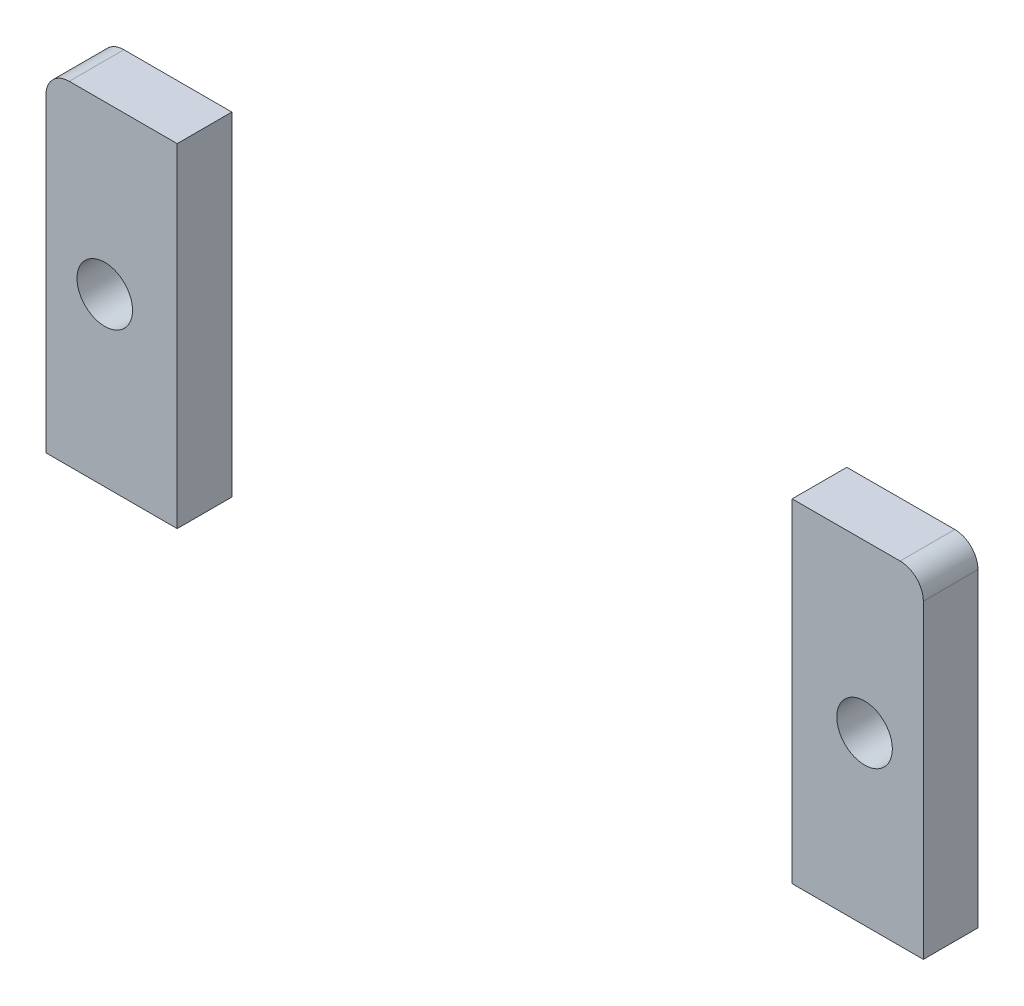
ISO-10303-21;
HEADER;
FILE_DESCRIPTION(('STEP AP214'),'2;1');
FILE_NAME('part.step','',(''),(''),'','','');
FILE_SCHEMA(('AUTOMOTIVE_DESIGN { 1 0 10303 214 1 1 1 1 }'));
ENDSEC;
DATA;
#1=APPLICATION_CONTEXT('core data for automotive mechanical design processes');
#2=APPLICATION_PROTOCOL_DEFINITION('international standard','automotive_design',2000,#1);
#3=PRODUCT_CONTEXT('',#1,'mechanical');
#4=PRODUCT('Part','Part','',(#3));
#5=PRODUCT_RELATED_PRODUCT_CATEGORY('part','',(#4));
#6=PRODUCT_DEFINITION_FORMATION('','',#4);
#7=PRODUCT_DEFINITION_CONTEXT('part definition',#1,'design');
#8=PRODUCT_DEFINITION('design','',#6,#7);
#9=PRODUCT_DEFINITION_SHAPE('','',#8);
#10=(LENGTH_UNIT() NAMED_UNIT(*) SI_UNIT(.MILLI.,.METRE.));
#11=(NAMED_UNIT(*) PLANE_ANGLE_UNIT() SI_UNIT($,.RADIAN.));
#12=(NAMED_UNIT(*) SI_UNIT($,.STERADIAN.) SOLID_ANGLE_UNIT());
#13=UNCERTAINTY_MEASURE_WITH_UNIT(LENGTH_MEASURE(1.E-05),#10,'distance_accuracy_value','');
#14=(GEOMETRIC_REPRESENTATION_CONTEXT(3) GLOBAL_UNCERTAINTY_ASSIGNED_CONTEXT((#13)) GLOBAL_UNIT_ASSIGNED_CONTEXT((#10,
#11,#12)) REPRESENTATION_CONTEXT('',''));
#15=CARTESIAN_POINT('',(0.,0.,0.));
#16=DIRECTION('',(0.,0.,1.));
#17=DIRECTION('',(1.,0.,0.));
#18=AXIS2_PLACEMENT_3D('',#15,#16,#17);
#19=CARTESIAN_POINT('',(-16.05,0.,2.));
#20=DIRECTION('',(1.,0.,0.));
#21=DIRECTION('',(0.,1.,0.));
#22=AXIS2_PLACEMENT_3D('',#19,#20,#21);
#23=PLANE('',#22);
#24=DIRECTION('',(0.,-1.,0.));
#25=VECTOR('',#24,1.);
#26=CARTESIAN_POINT('',(-16.05,0.,0.));
#27=LINE('',#26,#25);
#28=CARTESIAN_POINT('',(-16.05,5.25,0.));
#29=VERTEX_POINT('',#28);
#30=CARTESIAN_POINT('',(-16.05,-6.09999999999999,0.));
#31=VERTEX_POINT('',#30);
#32=EDGE_CURVE('E124',#29,#31,#27,.T.);
#33=ORIENTED_EDGE('',*,*,#32,.T.);
#34=DIRECTION('',(0.,0.,-1.));
#35=VECTOR('',#34,1.);
#36=CARTESIAN_POINT('',(-16.05,-6.09999999999999,2.));
#37=LINE('',#36,#35);
#38=CARTESIAN_POINT('',(-16.05,-6.09999999999999,2.));
#39=VERTEX_POINT('',#38);
#40=EDGE_CURVE('E12',#39,#31,#37,.T.);
#41=ORIENTED_EDGE('',*,*,#40,.F.);
#42=DIRECTION('',(0.,-1.,0.));
#43=VECTOR('',#42,1.);
#44=CARTESIAN_POINT('',(-16.05,0.,2.));
#45=LINE('',#44,#43);
#46=CARTESIAN_POINT('',(-16.05,5.25,2.));
#47=VERTEX_POINT('',#46);
#48=EDGE_CURVE('E92',#47,#39,#45,.T.);
#49=ORIENTED_EDGE('',*,*,#48,.F.);
#50=DIRECTION('',(0.,0.,-1.));
#51=VECTOR('',#50,1.);
#52=CARTESIAN_POINT('',(-16.05,5.25,2.));
#53=LINE('',#52,#51);
#54=EDGE_CURVE('E120',#47,#29,#53,.T.);
#55=ORIENTED_EDGE('',*,*,#54,.T.);
#56=EDGE_LOOP('',(#33,#41,#49,#55));
#57=FACE_BOUND('',#56,.T.);
#58=ADVANCED_FACE('F45',(#57),#23,.F.);
#59=CARTESIAN_POINT('',(0.,-6.1,2.));
#60=DIRECTION('',(0.,-1.,0.));
#61=DIRECTION('',(1.,0.,0.));
#62=AXIS2_PLACEMENT_3D('',#59,#60,#61);
#63=PLANE('',#62);
#64=DIRECTION('',(-1.,0.,0.));
#65=VECTOR('',#64,1.);
#66=CARTESIAN_POINT('',(0.,-6.1,0.));
#67=LINE('',#66,#65);
#68=CARTESIAN_POINT('',(-11.25,-6.1,0.));
#69=VERTEX_POINT('',#68);
#70=EDGE_CURVE('E127',#69,#31,#67,.T.);
#71=ORIENTED_EDGE('',*,*,#70,.F.);
#72=DIRECTION('',(0.,0.,-1.));
#73=VECTOR('',#72,1.);
#74=CARTESIAN_POINT('',(-11.25,-6.1,2.));
#75=LINE('',#74,#73);
#76=CARTESIAN_POINT('',(-11.25,-6.1,2.));
#77=VERTEX_POINT('',#76);
#78=EDGE_CURVE('E54',#77,#69,#75,.T.);
#79=ORIENTED_EDGE('',*,*,#78,.F.);
#80=DIRECTION('',(-1.,0.,0.));
#81=VECTOR('',#80,1.);
#82=CARTESIAN_POINT('',(0.,-6.1,2.));
#83=LINE('',#82,#81);
#84=EDGE_CURVE('E114',#77,#39,#83,.T.);
#85=ORIENTED_EDGE('',*,*,#84,.T.);
#86=ORIENTED_EDGE('',*,*,#40,.T.);
#87=EDGE_LOOP('',(#71,#79,#85,#86));
#88=FACE_BOUND('',#87,.T.);
#89=ADVANCED_FACE('F137',(#88),#63,.T.);
#90=CARTESIAN_POINT('',(-11.25,0.,2.));
#91=DIRECTION('',(1.,0.,0.));
#92=DIRECTION('',(0.,1.,0.));
#93=AXIS2_PLACEMENT_3D('',#90,#91,#92);
#94=PLANE('',#93);
#95=DIRECTION('',(0.,-1.,0.));
#96=VECTOR('',#95,1.);
#97=CARTESIAN_POINT('',(-11.25,0.,0.));
#98=LINE('',#97,#96);
#99=CARTESIAN_POINT('',(-11.25,6.1,0.));
#100=VERTEX_POINT('',#99);
#101=EDGE_CURVE('E106',#100,#69,#98,.T.);
#102=ORIENTED_EDGE('',*,*,#101,.F.);
#103=DIRECTION('',(0.,0.,-1.));
#104=VECTOR('',#103,1.);
#105=CARTESIAN_POINT('',(-11.25,6.1,2.));
#106=LINE('',#105,#104);
#107=CARTESIAN_POINT('',(-11.25,6.1,2.));
#108=VERTEX_POINT('',#107);
#109=EDGE_CURVE('E100',#108,#100,#106,.T.);
#110=ORIENTED_EDGE('',*,*,#109,.F.);
#111=DIRECTION('',(0.,-1.,0.));
#112=VECTOR('',#111,1.);
#113=CARTESIAN_POINT('',(-11.25,0.,2.));
#114=LINE('',#113,#112);
#115=EDGE_CURVE('E104',#108,#77,#114,.T.);
#116=ORIENTED_EDGE('',*,*,#115,.T.);
#117=ORIENTED_EDGE('',*,*,#78,.T.);
#118=EDGE_LOOP('',(#102,#110,#116,#117));
#119=FACE_BOUND('',#118,.T.);
#120=ADVANCED_FACE('F102',(#119),#94,.T.);
#121=CARTESIAN_POINT('',(0.,6.1,2.));
#122=DIRECTION('',(0.,-1.,0.));
#123=DIRECTION('',(0.,0.,-1.));
#124=AXIS2_PLACEMENT_3D('',#121,#122,#123);
#125=PLANE('',#124);
#126=DIRECTION('',(-1.,0.,0.));
#127=VECTOR('',#126,1.);
#128=CARTESIAN_POINT('',(0.,6.1,0.));
#129=LINE('',#128,#127);
#130=CARTESIAN_POINT('',(-15.2,6.1,0.));
#131=VERTEX_POINT('',#130);
#132=EDGE_CURVE('E80',#100,#131,#129,.T.);
#133=ORIENTED_EDGE('',*,*,#132,.T.);
#134=DIRECTION('',(0.,0.,-1.));
#135=VECTOR('',#134,1.);
#136=CARTESIAN_POINT('',(-15.2,6.1,2.));
#137=LINE('',#136,#135);
#138=CARTESIAN_POINT('',(-15.2,6.1,2.));
#139=VERTEX_POINT('',#138);
#140=EDGE_CURVE('E107',#139,#131,#137,.T.);
#141=ORIENTED_EDGE('',*,*,#140,.F.);
#142=DIRECTION('',(-1.,0.,0.));
#143=VECTOR('',#142,1.);
#144=CARTESIAN_POINT('',(0.,6.1,2.));
#145=LINE('',#144,#143);
#146=EDGE_CURVE('E109',#108,#139,#145,.T.);
#147=ORIENTED_EDGE('',*,*,#146,.F.);
#148=ORIENTED_EDGE('',*,*,#109,.T.);
#149=EDGE_LOOP('',(#133,#141,#147,#148));
#150=FACE_BOUND('',#149,.T.);
#151=ADVANCED_FACE('F110',(#150),#125,.F.);
#152=CARTESIAN_POINT('',(-13.9,0.,2.));
#153=DIRECTION('',(0.,0.,-1.));
#154=DIRECTION('',(-1.,0.,0.));
#155=AXIS2_PLACEMENT_3D('',#152,#153,#154);
#156=CYLINDRICAL_SURFACE('',#155,1.016);
#157=CARTESIAN_POINT('',(-13.9,0.,2.));
#158=DIRECTION('',(0.,0.,1.));
#159=DIRECTION('',(1.,0.,0.));
#160=AXIS2_PLACEMENT_3D('',#157,#158,#159);
#161=CIRCLE('',#160,1.016);
#162=CARTESIAN_POINT('',(-12.884,0.,2.));
#163=VERTEX_POINT('',#162);
#164=EDGE_CURVE('E133',#163,#163,#161,.T.);
#165=ORIENTED_EDGE('',*,*,#164,.T.);
#166=EDGE_LOOP('',(#165));
#167=FACE_BOUND('',#166,.T.);
#168=CARTESIAN_POINT('',(-13.9,0.,0.));
#169=DIRECTION('',(0.,0.,1.));
#170=DIRECTION('',(1.,0.,0.));
#171=AXIS2_PLACEMENT_3D('',#168,#169,#170);
#172=CIRCLE('',#171,1.016);
#173=CARTESIAN_POINT('',(-12.884,0.,0.));
#174=VERTEX_POINT('',#173);
#175=EDGE_CURVE('E121',#174,#174,#172,.T.);
#176=ORIENTED_EDGE('',*,*,#175,.F.);
#177=EDGE_LOOP('',(#176));
#178=FACE_BOUND('',#177,.T.);
#179=ADVANCED_FACE('F47',(#167,#178),#156,.F.);
#180=CARTESIAN_POINT('',(-15.2,5.25,2.));
#181=DIRECTION('',(0.,0.,-1.));
#182=DIRECTION('',(-1.,0.,0.));
#183=AXIS2_PLACEMENT_3D('',#180,#181,#182);
#184=CYLINDRICAL_SURFACE('',#183,0.850000000000002);
#185=CARTESIAN_POINT('',(-15.2,5.25,0.));
#186=DIRECTION('',(0.,0.,1.));
#187=DIRECTION('',(1.,0.,0.));
#188=AXIS2_PLACEMENT_3D('',#185,#186,#187);
#189=CIRCLE('',#188,0.850000000000002);
#190=EDGE_CURVE('E86',#131,#29,#189,.T.);
#191=ORIENTED_EDGE('',*,*,#190,.T.);
#192=ORIENTED_EDGE('',*,*,#54,.F.);
#193=CARTESIAN_POINT('',(-15.2,5.25,2.));
#194=DIRECTION('',(0.,0.,1.));
#195=DIRECTION('',(1.,0.,0.));
#196=AXIS2_PLACEMENT_3D('',#193,#194,#195);
#197=CIRCLE('',#196,0.850000000000002);
#198=EDGE_CURVE('E62',#139,#47,#197,.T.);
#199=ORIENTED_EDGE('',*,*,#198,.F.);
#200=ORIENTED_EDGE('',*,*,#140,.T.);
#201=EDGE_LOOP('',(#191,#192,#199,#200));
#202=FACE_BOUND('',#201,.T.);
#203=ADVANCED_FACE('F142',(#202),#184,.T.);
#204=CARTESIAN_POINT('',(0.,0.,2.));
#205=DIRECTION('',(0.,0.,1.));
#206=DIRECTION('',(1.,0.,0.));
#207=AXIS2_PLACEMENT_3D('',#204,#205,#206);
#208=PLANE('',#207);
#209=ORIENTED_EDGE('',*,*,#164,.F.);
#210=EDGE_LOOP('',(#209));
#211=FACE_BOUND('',#210,.T.);
#212=ORIENTED_EDGE('',*,*,#48,.T.);
#213=ORIENTED_EDGE('',*,*,#84,.F.);
#214=ORIENTED_EDGE('',*,*,#115,.F.);
#215=ORIENTED_EDGE('',*,*,#146,.T.);
#216=ORIENTED_EDGE('',*,*,#198,.T.);
#217=EDGE_LOOP('',(#212,#213,#214,#215,#216));
#218=FACE_BOUND('',#217,.T.);
#219=ADVANCED_FACE('F112',(#211,#218),#208,.T.);
#220=CARTESIAN_POINT('',(0.,0.,0.));
#221=DIRECTION('',(0.,0.,1.));
#222=DIRECTION('',(1.,0.,0.));
#223=AXIS2_PLACEMENT_3D('',#220,#221,#222);
#224=PLANE('',#223);
#225=ORIENTED_EDGE('',*,*,#175,.T.);
#226=EDGE_LOOP('',(#225));
#227=FACE_BOUND('',#226,.T.);
#228=ORIENTED_EDGE('',*,*,#32,.F.);
#229=ORIENTED_EDGE('',*,*,#190,.F.);
#230=ORIENTED_EDGE('',*,*,#132,.F.);
#231=ORIENTED_EDGE('',*,*,#101,.T.);
#232=ORIENTED_EDGE('',*,*,#70,.T.);
#233=EDGE_LOOP('',(#228,#229,#230,#231,#232));
#234=FACE_BOUND('',#233,.T.);
#235=ADVANCED_FACE('F140',(#227,#234),#224,.F.);
#236=CLOSED_SHELL('',(#58,#89,#120,#151,#179,#203,#219,#235));
#237=MANIFOLD_SOLID_BREP('B2',#236);
#238=CARTESIAN_POINT('',(16.05,0.,2.));
#239=DIRECTION('',(1.,0.,0.));
#240=DIRECTION('',(0.,0.,-1.));
#241=AXIS2_PLACEMENT_3D('',#238,#239,#240);
#242=PLANE('',#241);
#243=DIRECTION('',(0.,-1.,0.));
#244=VECTOR('',#243,1.);
#245=CARTESIAN_POINT('',(16.05,0.,0.));
#246=LINE('',#245,#244);
#247=CARTESIAN_POINT('',(16.05,5.25,0.));
#248=VERTEX_POINT('',#247);
#249=CARTESIAN_POINT('',(16.05,-6.09999999999999,0.));
#250=VERTEX_POINT('',#249);
#251=EDGE_CURVE('E308',#248,#250,#246,.T.);
#252=ORIENTED_EDGE('',*,*,#251,.F.);
#253=DIRECTION('',(0.,0.,-1.));
#254=VECTOR('',#253,1.);
#255=CARTESIAN_POINT('',(16.05,5.25,2.));
#256=LINE('',#255,#254);
#257=CARTESIAN_POINT('',(16.05,5.25,2.));
#258=VERTEX_POINT('',#257);
#259=EDGE_CURVE('E43',#258,#248,#256,.T.);
#260=ORIENTED_EDGE('',*,*,#259,.F.);
#261=DIRECTION('',(0.,-1.,0.));
#262=VECTOR('',#261,1.);
#263=CARTESIAN_POINT('',(16.05,0.,2.));
#264=LINE('',#263,#262);
#265=CARTESIAN_POINT('',(16.05,-6.09999999999999,2.));
#266=VERTEX_POINT('',#265);
#267=EDGE_CURVE('E327',#258,#266,#264,.T.);
#268=ORIENTED_EDGE('',*,*,#267,.T.);
#269=DIRECTION('',(0.,0.,-1.));
#270=VECTOR('',#269,1.);
#271=CARTESIAN_POINT('',(16.05,-6.09999999999999,2.));
#272=LINE('',#271,#270);
#273=EDGE_CURVE('E273',#266,#250,#272,.T.);
#274=ORIENTED_EDGE('',*,*,#273,.T.);
#275=EDGE_LOOP('',(#252,#260,#268,#274));
#276=FACE_BOUND('',#275,.T.);
#277=ADVANCED_FACE('F231',(#276),#242,.T.);
#278=CARTESIAN_POINT('',(15.2,5.25,2.));
#279=DIRECTION('',(0.,0.,-1.));
#280=DIRECTION('',(-1.,0.,0.));
#281=AXIS2_PLACEMENT_3D('',#278,#279,#280);
#282=CYLINDRICAL_SURFACE('',#281,0.849999999999998);
#283=CARTESIAN_POINT('',(15.2,5.25,0.));
#284=DIRECTION('',(0.,0.,1.));
#285=DIRECTION('',(1.,0.,0.));
#286=AXIS2_PLACEMENT_3D('',#283,#284,#285);
#287=CIRCLE('',#286,0.849999999999998);
#288=CARTESIAN_POINT('',(15.2,6.1,0.));
#289=VERTEX_POINT('',#288);
#290=EDGE_CURVE('E311',#248,#289,#287,.T.);
#291=ORIENTED_EDGE('',*,*,#290,.T.);
#292=DIRECTION('',(0.,0.,-1.));
#293=VECTOR('',#292,1.);
#294=CARTESIAN_POINT('',(15.2,6.1,2.));
#295=LINE('',#294,#293);
#296=CARTESIAN_POINT('',(15.2,6.1,2.));
#297=VERTEX_POINT('',#296);
#298=EDGE_CURVE('E240',#297,#289,#295,.T.);
#299=ORIENTED_EDGE('',*,*,#298,.F.);
#300=CARTESIAN_POINT('',(15.2,5.25,2.));
#301=DIRECTION('',(0.,0.,1.));
#302=DIRECTION('',(1.,0.,0.));
#303=AXIS2_PLACEMENT_3D('',#300,#301,#302);
#304=CIRCLE('',#303,0.849999999999998);
#305=EDGE_CURVE('E297',#258,#297,#304,.T.);
#306=ORIENTED_EDGE('',*,*,#305,.F.);
#307=ORIENTED_EDGE('',*,*,#259,.T.);
#308=EDGE_LOOP('',(#291,#299,#306,#307));
#309=FACE_BOUND('',#308,.T.);
#310=ADVANCED_FACE('F323',(#309),#282,.T.);
#311=CARTESIAN_POINT('',(-0.00908182738110785,6.07727166673534,2.));
#312=DIRECTION('',(-0.00149439053219066,0.999998883397845,0.));
#313=DIRECTION('',(-0.999998883397845,-0.00149439053219066,0.));
#314=AXIS2_PLACEMENT_3D('',#311,#312,#313);
#315=PLANE('',#314);
#316=DIRECTION('',(0.999998883397845,0.00149439053219066,0.));
#317=VECTOR('',#316,1.);
#318=CARTESIAN_POINT('',(-0.00908182738110785,6.07727166673534,0.));
#319=LINE('',#318,#317);
#320=CARTESIAN_POINT('',(11.25,6.09409715080671,0.));
#321=VERTEX_POINT('',#320);
#322=EDGE_CURVE('E289',#321,#289,#319,.T.);
#323=ORIENTED_EDGE('',*,*,#322,.F.);
#324=DIRECTION('',(0.,0.,-1.));
#325=VECTOR('',#324,1.);
#326=CARTESIAN_POINT('',(11.25,6.09409715080671,2.));
#327=LINE('',#326,#325);
#328=CARTESIAN_POINT('',(11.25,6.09409715080671,2.));
#329=VERTEX_POINT('',#328);
#330=EDGE_CURVE('E284',#329,#321,#327,.T.);
#331=ORIENTED_EDGE('',*,*,#330,.F.);
#332=DIRECTION('',(0.999998883397845,0.00149439053219066,0.));
#333=VECTOR('',#332,1.);
#334=CARTESIAN_POINT('',(-0.00908182738110785,6.07727166673534,2.));
#335=LINE('',#334,#333);
#336=EDGE_CURVE('E287',#329,#297,#335,.T.);
#337=ORIENTED_EDGE('',*,*,#336,.T.);
#338=ORIENTED_EDGE('',*,*,#298,.T.);
#339=EDGE_LOOP('',(#323,#331,#337,#338));
#340=FACE_BOUND('',#339,.T.);
#341=ADVANCED_FACE('F286',(#340),#315,.T.);
#342=CARTESIAN_POINT('',(11.25,0.,2.));
#343=DIRECTION('',(-1.,0.,0.));
#344=DIRECTION('',(0.,-1.,0.));
#345=AXIS2_PLACEMENT_3D('',#342,#343,#344);
#346=PLANE('',#345);
#347=DIRECTION('',(0.,1.,0.));
#348=VECTOR('',#347,1.);
#349=CARTESIAN_POINT('',(11.25,0.,0.));
#350=LINE('',#349,#348);
#351=CARTESIAN_POINT('',(11.25,-6.1,0.));
#352=VERTEX_POINT('',#351);
#353=EDGE_CURVE('E315',#352,#321,#350,.T.);
#354=ORIENTED_EDGE('',*,*,#353,.F.);
#355=DIRECTION('',(0.,0.,-1.));
#356=VECTOR('',#355,1.);
#357=CARTESIAN_POINT('',(11.25,-6.1,2.));
#358=LINE('',#357,#356);
#359=CARTESIAN_POINT('',(11.25,-6.1,2.));
#360=VERTEX_POINT('',#359);
#361=EDGE_CURVE('E266',#360,#352,#358,.T.);
#362=ORIENTED_EDGE('',*,*,#361,.F.);
#363=DIRECTION('',(0.,1.,0.));
#364=VECTOR('',#363,1.);
#365=CARTESIAN_POINT('',(11.25,0.,2.));
#366=LINE('',#365,#364);
#367=EDGE_CURVE('E296',#360,#329,#366,.T.);
#368=ORIENTED_EDGE('',*,*,#367,.T.);
#369=ORIENTED_EDGE('',*,*,#330,.T.);
#370=EDGE_LOOP('',(#354,#362,#368,#369));
#371=FACE_BOUND('',#370,.T.);
#372=ADVANCED_FACE('F300',(#371),#346,.T.);
#373=CARTESIAN_POINT('',(13.9,0.,2.));
#374=DIRECTION('',(0.,0.,-1.));
#375=DIRECTION('',(-1.,0.,0.));
#376=AXIS2_PLACEMENT_3D('',#373,#374,#375);
#377=CYLINDRICAL_SURFACE('',#376,1.016);
#378=CARTESIAN_POINT('',(13.9,0.,2.));
#379=DIRECTION('',(0.,0.,1.));
#380=DIRECTION('',(1.,0.,0.));
#381=AXIS2_PLACEMENT_3D('',#378,#379,#380);
#382=CIRCLE('',#381,1.016);
#383=CARTESIAN_POINT('',(14.916,0.,2.));
#384=VERTEX_POINT('',#383);
#385=EDGE_CURVE('E319',#384,#384,#382,.T.);
#386=ORIENTED_EDGE('',*,*,#385,.T.);
#387=EDGE_LOOP('',(#386));
#388=FACE_BOUND('',#387,.T.);
#389=CARTESIAN_POINT('',(13.9,0.,0.));
#390=DIRECTION('',(0.,0.,1.));
#391=DIRECTION('',(1.,0.,0.));
#392=AXIS2_PLACEMENT_3D('',#389,#390,#391);
#393=CIRCLE('',#392,1.016);
#394=CARTESIAN_POINT('',(14.916,0.,0.));
#395=VERTEX_POINT('',#394);
#396=EDGE_CURVE('E305',#395,#395,#393,.T.);
#397=ORIENTED_EDGE('',*,*,#396,.F.);
#398=EDGE_LOOP('',(#397));
#399=FACE_BOUND('',#398,.T.);
#400=ADVANCED_FACE('F233',(#388,#399),#377,.F.);
#401=CARTESIAN_POINT('',(0.,-6.1,2.));
#402=DIRECTION('',(0.,1.,0.));
#403=DIRECTION('',(-1.,0.,0.));
#404=AXIS2_PLACEMENT_3D('',#401,#402,#403);
#405=PLANE('',#404);
#406=DIRECTION('',(1.,0.,0.));
#407=VECTOR('',#406,1.);
#408=CARTESIAN_POINT('',(0.,-6.1,0.));
#409=LINE('',#408,#407);
#410=EDGE_CURVE('E317',#352,#250,#409,.T.);
#411=ORIENTED_EDGE('',*,*,#410,.T.);
#412=ORIENTED_EDGE('',*,*,#273,.F.);
#413=DIRECTION('',(1.,0.,0.));
#414=VECTOR('',#413,1.);
#415=CARTESIAN_POINT('',(0.,-6.1,2.));
#416=LINE('',#415,#414);
#417=EDGE_CURVE('E248',#360,#266,#416,.T.);
#418=ORIENTED_EDGE('',*,*,#417,.F.);
#419=ORIENTED_EDGE('',*,*,#361,.T.);
#420=EDGE_LOOP('',(#411,#412,#418,#419));
#421=FACE_BOUND('',#420,.T.);
#422=ADVANCED_FACE('F326',(#421),#405,.F.);
#423=CARTESIAN_POINT('',(0.,0.,2.));
#424=DIRECTION('',(0.,0.,1.));
#425=DIRECTION('',(1.,0.,0.));
#426=AXIS2_PLACEMENT_3D('',#423,#424,#425);
#427=PLANE('',#426);
#428=ORIENTED_EDGE('',*,*,#385,.F.);
#429=EDGE_LOOP('',(#428));
#430=FACE_BOUND('',#429,.T.);
#431=ORIENTED_EDGE('',*,*,#267,.F.);
#432=ORIENTED_EDGE('',*,*,#305,.T.);
#433=ORIENTED_EDGE('',*,*,#336,.F.);
#434=ORIENTED_EDGE('',*,*,#367,.F.);
#435=ORIENTED_EDGE('',*,*,#417,.T.);
#436=EDGE_LOOP('',(#431,#432,#433,#434,#435));
#437=FACE_BOUND('',#436,.T.);
#438=ADVANCED_FACE('F295',(#430,#437),#427,.T.);
#439=CARTESIAN_POINT('',(0.,0.,0.));
#440=DIRECTION('',(0.,0.,1.));
#441=DIRECTION('',(1.,0.,0.));
#442=AXIS2_PLACEMENT_3D('',#439,#440,#441);
#443=PLANE('',#442);
#444=ORIENTED_EDGE('',*,*,#396,.T.);
#445=EDGE_LOOP('',(#444));
#446=FACE_BOUND('',#445,.T.);
#447=ORIENTED_EDGE('',*,*,#251,.T.);
#448=ORIENTED_EDGE('',*,*,#410,.F.);
#449=ORIENTED_EDGE('',*,*,#353,.T.);
#450=ORIENTED_EDGE('',*,*,#322,.T.);
#451=ORIENTED_EDGE('',*,*,#290,.F.);
#452=EDGE_LOOP('',(#447,#448,#449,#450,#451));
#453=FACE_BOUND('',#452,.T.);
#454=ADVANCED_FACE('F325',(#446,#453),#443,.F.);
#455=CLOSED_SHELL('',(#277,#310,#341,#372,#400,#422,#438,#454));
#456=MANIFOLD_SOLID_BREP('B6',#455);
#457=ADVANCED_BREP_SHAPE_REPRESENTATION('',(#18,#237,#456),#14);
#458=SHAPE_DEFINITION_REPRESENTATION(#9,#457);
ENDSEC;
END-ISO-10303-21;
